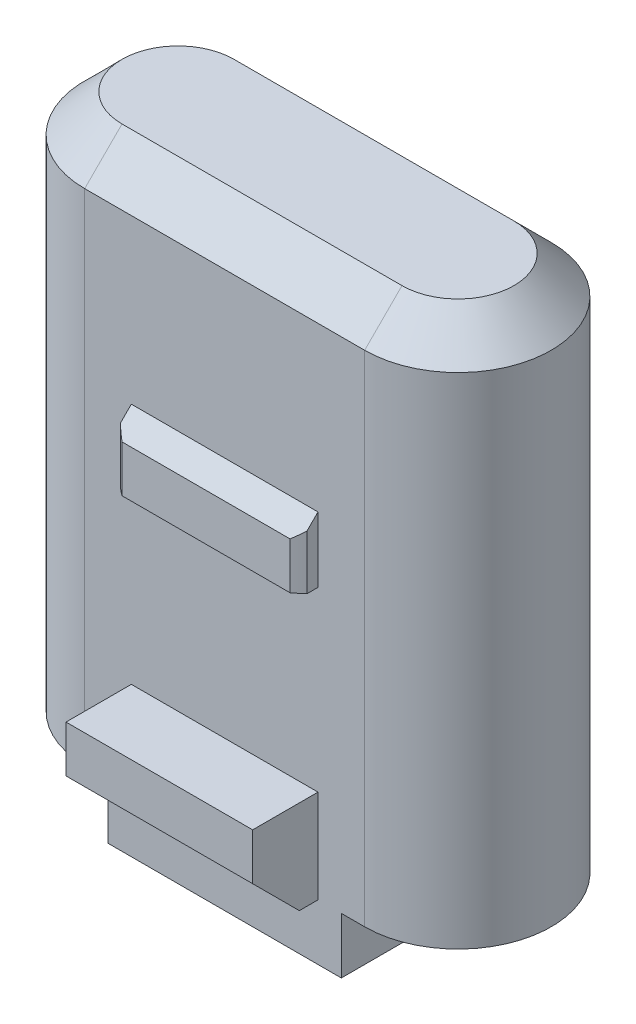
ISO-10303-21;
HEADER;
FILE_DESCRIPTION(('STEP AP214'),'2;1');
FILE_NAME('part.step','',(''),(''),'','','');
FILE_SCHEMA(('AUTOMOTIVE_DESIGN { 1 0 10303 214 1 1 1 1 }'));
ENDSEC;
DATA;
#1=APPLICATION_CONTEXT('core data for automotive mechanical design processes');
#2=APPLICATION_PROTOCOL_DEFINITION('international standard','automotive_design',2000,#1);
#3=PRODUCT_CONTEXT('',#1,'mechanical');
#4=PRODUCT('Part','Part','',(#3));
#5=PRODUCT_RELATED_PRODUCT_CATEGORY('part','',(#4));
#6=PRODUCT_DEFINITION_FORMATION('','',#4);
#7=PRODUCT_DEFINITION_CONTEXT('part definition',#1,'design');
#8=PRODUCT_DEFINITION('design','',#6,#7);
#9=PRODUCT_DEFINITION_SHAPE('','',#8);
#10=(LENGTH_UNIT() NAMED_UNIT(*) SI_UNIT(.MILLI.,.METRE.));
#11=(NAMED_UNIT(*) PLANE_ANGLE_UNIT() SI_UNIT($,.RADIAN.));
#12=(NAMED_UNIT(*) SI_UNIT($,.STERADIAN.) SOLID_ANGLE_UNIT());
#13=UNCERTAINTY_MEASURE_WITH_UNIT(LENGTH_MEASURE(1.E-05),#10,'distance_accuracy_value','');
#14=(GEOMETRIC_REPRESENTATION_CONTEXT(3) GLOBAL_UNCERTAINTY_ASSIGNED_CONTEXT((#13)) GLOBAL_UNIT_ASSIGNED_CONTEXT((#10,
#11,#12)) REPRESENTATION_CONTEXT('',''));
#15=CARTESIAN_POINT('',(0.,0.,0.));
#16=DIRECTION('',(0.,0.,1.));
#17=DIRECTION('',(1.,0.,0.));
#18=AXIS2_PLACEMENT_3D('',#15,#16,#17);
#19=CARTESIAN_POINT('',(0.,12.7,-2.));
#20=DIRECTION('',(0.,0.,1.));
#21=DIRECTION('',(1.,0.,0.));
#22=AXIS2_PLACEMENT_3D('',#19,#20,#21);
#23=PLANE('',#22);
#24=DIRECTION('',(0.,-1.,0.));
#25=VECTOR('',#24,1.);
#26=CARTESIAN_POINT('',(0.,12.7,-2.));
#27=LINE('',#26,#25);
#28=CARTESIAN_POINT('',(0.,11.9,-2.));
#29=VERTEX_POINT('',#28);
#30=CARTESIAN_POINT('',(0.,1.2,-2.));
#31=VERTEX_POINT('',#30);
#32=EDGE_CURVE('E330',#29,#31,#27,.T.);
#33=ORIENTED_EDGE('',*,*,#32,.F.);
#34=DIRECTION('',(1.,0.,0.));
#35=VECTOR('',#34,1.);
#36=CARTESIAN_POINT('',(6.,11.9,-2.));
#37=LINE('',#36,#35);
#38=CARTESIAN_POINT('',(6.,11.9,-2.));
#39=VERTEX_POINT('',#38);
#40=EDGE_CURVE('E368',#29,#39,#37,.T.);
#41=ORIENTED_EDGE('',*,*,#40,.T.);
#42=DIRECTION('',(0.,-1.,0.));
#43=VECTOR('',#42,1.);
#44=CARTESIAN_POINT('',(6.,12.7,-2.));
#45=LINE('',#44,#43);
#46=CARTESIAN_POINT('',(6.,1.2,-2.));
#47=VERTEX_POINT('',#46);
#48=EDGE_CURVE('E332',#39,#47,#45,.T.);
#49=ORIENTED_EDGE('',*,*,#48,.T.);
#50=DIRECTION('',(1.,0.,0.));
#51=VECTOR('',#50,1.);
#52=CARTESIAN_POINT('',(8.,1.2,-2.));
#53=LINE('',#52,#51);
#54=CARTESIAN_POINT('',(5.5,1.2,-2.));
#55=VERTEX_POINT('',#54);
#56=EDGE_CURVE('E285',#55,#47,#53,.T.);
#57=ORIENTED_EDGE('',*,*,#56,.F.);
#58=DIRECTION('',(0.,1.,0.));
#59=VECTOR('',#58,1.);
#60=CARTESIAN_POINT('',(5.5,0.,-2.));
#61=LINE('',#60,#59);
#62=CARTESIAN_POINT('',(5.5,0.,-2.));
#63=VERTEX_POINT('',#62);
#64=EDGE_CURVE('E321',#63,#55,#61,.T.);
#65=ORIENTED_EDGE('',*,*,#64,.F.);
#66=DIRECTION('',(-1.,0.,0.));
#67=VECTOR('',#66,1.);
#68=CARTESIAN_POINT('',(0.,0.,-2.));
#69=LINE('',#68,#67);
#70=CARTESIAN_POINT('',(0.5,0.,-2.));
#71=VERTEX_POINT('',#70);
#72=EDGE_CURVE('E327',#63,#71,#69,.T.);
#73=ORIENTED_EDGE('',*,*,#72,.T.);
#74=DIRECTION('',(0.,-1.,0.));
#75=VECTOR('',#74,1.);
#76=CARTESIAN_POINT('',(0.5,0.,-2.));
#77=LINE('',#76,#75);
#78=CARTESIAN_POINT('',(0.5,1.2,-2.));
#79=VERTEX_POINT('',#78);
#80=EDGE_CURVE('E292',#79,#71,#77,.T.);
#81=ORIENTED_EDGE('',*,*,#80,.F.);
#82=DIRECTION('',(1.,0.,0.));
#83=VECTOR('',#82,1.);
#84=CARTESIAN_POINT('',(-2.,1.2,-2.));
#85=LINE('',#84,#83);
#86=EDGE_CURVE('E295',#31,#79,#85,.T.);
#87=ORIENTED_EDGE('',*,*,#86,.F.);
#88=EDGE_LOOP('',(#33,#41,#49,#57,#65,#73,#81,#87));
#89=FACE_BOUND('',#88,.T.);
#90=DIRECTION('',(-1.,0.,0.));
#91=VECTOR('',#90,1.);
#92=CARTESIAN_POINT('',(5.,7.,-2.));
#93=LINE('',#92,#91);
#94=CARTESIAN_POINT('',(5.,7.,-2.));
#95=VERTEX_POINT('',#94);
#96=CARTESIAN_POINT('',(1.,7.,-2.));
#97=VERTEX_POINT('',#96);
#98=EDGE_CURVE('E283',#95,#97,#93,.T.);
#99=ORIENTED_EDGE('',*,*,#98,.F.);
#100=DIRECTION('',(0.,1.,0.));
#101=VECTOR('',#100,1.);
#102=CARTESIAN_POINT('',(5.,8.4,-2.));
#103=LINE('',#102,#101);
#104=CARTESIAN_POINT('',(5.,8.4,-2.));
#105=VERTEX_POINT('',#104);
#106=EDGE_CURVE('E274',#95,#105,#103,.T.);
#107=ORIENTED_EDGE('',*,*,#106,.T.);
#108=DIRECTION('',(-1.,0.,0.));
#109=VECTOR('',#108,1.);
#110=CARTESIAN_POINT('',(5.,8.4,-2.));
#111=LINE('',#110,#109);
#112=CARTESIAN_POINT('',(1.,8.4,-2.));
#113=VERTEX_POINT('',#112);
#114=EDGE_CURVE('E275',#105,#113,#111,.T.);
#115=ORIENTED_EDGE('',*,*,#114,.T.);
#116=DIRECTION('',(0.,1.,0.));
#117=VECTOR('',#116,1.);
#118=CARTESIAN_POINT('',(1.,8.4,-2.));
#119=LINE('',#118,#117);
#120=EDGE_CURVE('E492',#97,#113,#119,.T.);
#121=ORIENTED_EDGE('',*,*,#120,.F.);
#122=EDGE_LOOP('',(#99,#107,#115,#121));
#123=FACE_BOUND('',#122,.T.);
#124=DIRECTION('',(0.,1.,0.));
#125=VECTOR('',#124,1.);
#126=CARTESIAN_POINT('',(5.,1.2,-2.));
#127=LINE('',#126,#125);
#128=CARTESIAN_POINT('',(5.,1.2,-2.));
#129=VERTEX_POINT('',#128);
#130=CARTESIAN_POINT('',(5.,3.2,-2.));
#131=VERTEX_POINT('',#130);
#132=EDGE_CURVE('E453',#129,#131,#127,.T.);
#133=ORIENTED_EDGE('',*,*,#132,.T.);
#134=DIRECTION('',(-1.,0.,0.));
#135=VECTOR('',#134,1.);
#136=CARTESIAN_POINT('',(5.,3.2,-2.));
#137=LINE('',#136,#135);
#138=CARTESIAN_POINT('',(1.,3.2,-2.));
#139=VERTEX_POINT('',#138);
#140=EDGE_CURVE('E438',#131,#139,#137,.T.);
#141=ORIENTED_EDGE('',*,*,#140,.T.);
#142=DIRECTION('',(0.,1.,0.));
#143=VECTOR('',#142,1.);
#144=CARTESIAN_POINT('',(1.,1.2,-2.));
#145=LINE('',#144,#143);
#146=CARTESIAN_POINT('',(1.,1.2,-2.));
#147=VERTEX_POINT('',#146);
#148=EDGE_CURVE('E464',#147,#139,#145,.T.);
#149=ORIENTED_EDGE('',*,*,#148,.F.);
#150=DIRECTION('',(-1.,0.,0.));
#151=VECTOR('',#150,1.);
#152=CARTESIAN_POINT('',(5.,1.2,-2.));
#153=LINE('',#152,#151);
#154=EDGE_CURVE('E437',#129,#147,#153,.T.);
#155=ORIENTED_EDGE('',*,*,#154,.F.);
#156=EDGE_LOOP('',(#133,#141,#149,#155));
#157=FACE_BOUND('',#156,.T.);
#158=ADVANCED_FACE('F40',(#89,#123,#157),#23,.F.);
#159=CARTESIAN_POINT('',(0.,12.7,2.));
#160=DIRECTION('',(0.,0.,-1.));
#161=DIRECTION('',(-1.,0.,0.));
#162=AXIS2_PLACEMENT_3D('',#159,#160,#161);
#163=PLANE('',#162);
#164=DIRECTION('',(-1.,0.,0.));
#165=VECTOR('',#164,1.);
#166=CARTESIAN_POINT('',(5.,3.2,2.));
#167=LINE('',#166,#165);
#168=CARTESIAN_POINT('',(5.,3.2,2.));
#169=VERTEX_POINT('',#168);
#170=CARTESIAN_POINT('',(1.,3.2,2.));
#171=VERTEX_POINT('',#170);
#172=EDGE_CURVE('E406',#169,#171,#167,.T.);
#173=ORIENTED_EDGE('',*,*,#172,.F.);
#174=DIRECTION('',(0.,-1.,0.));
#175=VECTOR('',#174,1.);
#176=CARTESIAN_POINT('',(5.,1.2,2.));
#177=LINE('',#176,#175);
#178=CARTESIAN_POINT('',(5.,1.2,2.));
#179=VERTEX_POINT('',#178);
#180=EDGE_CURVE('E424',#169,#179,#177,.T.);
#181=ORIENTED_EDGE('',*,*,#180,.T.);
#182=DIRECTION('',(-1.,0.,0.));
#183=VECTOR('',#182,1.);
#184=CARTESIAN_POINT('',(5.,1.2,2.));
#185=LINE('',#184,#183);
#186=CARTESIAN_POINT('',(1.,1.2,2.));
#187=VERTEX_POINT('',#186);
#188=EDGE_CURVE('E409',#179,#187,#185,.T.);
#189=ORIENTED_EDGE('',*,*,#188,.T.);
#190=DIRECTION('',(0.,-1.,0.));
#191=VECTOR('',#190,1.);
#192=CARTESIAN_POINT('',(1.,1.2,2.));
#193=LINE('',#192,#191);
#194=EDGE_CURVE('E434',#171,#187,#193,.T.);
#195=ORIENTED_EDGE('',*,*,#194,.F.);
#196=EDGE_LOOP('',(#173,#181,#189,#195));
#197=FACE_BOUND('',#196,.T.);
#198=DIRECTION('',(0.,-1.,0.));
#199=VECTOR('',#198,1.);
#200=CARTESIAN_POINT('',(6.,12.7,2.));
#201=LINE('',#200,#199);
#202=CARTESIAN_POINT('',(6.,11.9,2.));
#203=VERTEX_POINT('',#202);
#204=CARTESIAN_POINT('',(6.,1.2,2.));
#205=VERTEX_POINT('',#204);
#206=EDGE_CURVE('E334',#203,#205,#201,.T.);
#207=ORIENTED_EDGE('',*,*,#206,.F.);
#208=DIRECTION('',(-1.,0.,0.));
#209=VECTOR('',#208,1.);
#210=CARTESIAN_POINT('',(0.,11.9,2.));
#211=LINE('',#210,#209);
#212=CARTESIAN_POINT('',(0.,11.9,2.));
#213=VERTEX_POINT('',#212);
#214=EDGE_CURVE('E50',#203,#213,#211,.T.);
#215=ORIENTED_EDGE('',*,*,#214,.T.);
#216=DIRECTION('',(0.,-1.,0.));
#217=VECTOR('',#216,1.);
#218=CARTESIAN_POINT('',(0.,12.7,2.));
#219=LINE('',#218,#217);
#220=CARTESIAN_POINT('',(0.,1.2,2.));
#221=VERTEX_POINT('',#220);
#222=EDGE_CURVE('E336',#213,#221,#219,.T.);
#223=ORIENTED_EDGE('',*,*,#222,.T.);
#224=DIRECTION('',(-1.,0.,0.));
#225=VECTOR('',#224,1.);
#226=CARTESIAN_POINT('',(-2.,1.2,2.));
#227=LINE('',#226,#225);
#228=CARTESIAN_POINT('',(0.5,1.2,2.));
#229=VERTEX_POINT('',#228);
#230=EDGE_CURVE('E301',#229,#221,#227,.T.);
#231=ORIENTED_EDGE('',*,*,#230,.F.);
#232=DIRECTION('',(0.,1.,0.));
#233=VECTOR('',#232,1.);
#234=CARTESIAN_POINT('',(0.5,0.,2.));
#235=LINE('',#234,#233);
#236=CARTESIAN_POINT('',(0.5,0.,2.));
#237=VERTEX_POINT('',#236);
#238=EDGE_CURVE('E298',#237,#229,#235,.T.);
#239=ORIENTED_EDGE('',*,*,#238,.F.);
#240=DIRECTION('',(1.,0.,0.));
#241=VECTOR('',#240,1.);
#242=CARTESIAN_POINT('',(0.,0.,2.));
#243=LINE('',#242,#241);
#244=CARTESIAN_POINT('',(5.5,0.,2.));
#245=VERTEX_POINT('',#244);
#246=EDGE_CURVE('E307',#237,#245,#243,.T.);
#247=ORIENTED_EDGE('',*,*,#246,.T.);
#248=DIRECTION('',(0.,-1.,0.));
#249=VECTOR('',#248,1.);
#250=CARTESIAN_POINT('',(5.5,0.,2.));
#251=LINE('',#250,#249);
#252=CARTESIAN_POINT('',(5.5,1.2,2.));
#253=VERTEX_POINT('',#252);
#254=EDGE_CURVE('E314',#253,#245,#251,.T.);
#255=ORIENTED_EDGE('',*,*,#254,.F.);
#256=DIRECTION('',(-1.,0.,0.));
#257=VECTOR('',#256,1.);
#258=CARTESIAN_POINT('',(8.,1.2,2.));
#259=LINE('',#258,#257);
#260=EDGE_CURVE('E318',#205,#253,#259,.T.);
#261=ORIENTED_EDGE('',*,*,#260,.F.);
#262=EDGE_LOOP('',(#207,#215,#223,#231,#239,#247,#255,#261));
#263=FACE_BOUND('',#262,.T.);
#264=DIRECTION('',(0.,-1.,0.));
#265=VECTOR('',#264,1.);
#266=CARTESIAN_POINT('',(5.,8.4,2.));
#267=LINE('',#266,#265);
#268=CARTESIAN_POINT('',(5.,8.4,2.));
#269=VERTEX_POINT('',#268);
#270=CARTESIAN_POINT('',(5.,7.,2.));
#271=VERTEX_POINT('',#270);
#272=EDGE_CURVE('E481',#269,#271,#267,.T.);
#273=ORIENTED_EDGE('',*,*,#272,.T.);
#274=DIRECTION('',(-1.,0.,0.));
#275=VECTOR('',#274,1.);
#276=CARTESIAN_POINT('',(5.,7.,2.));
#277=LINE('',#276,#275);
#278=CARTESIAN_POINT('',(1.,7.,2.));
#279=VERTEX_POINT('',#278);
#280=EDGE_CURVE('E472',#271,#279,#277,.T.);
#281=ORIENTED_EDGE('',*,*,#280,.T.);
#282=DIRECTION('',(0.,-1.,0.));
#283=VECTOR('',#282,1.);
#284=CARTESIAN_POINT('',(1.,8.4,2.));
#285=LINE('',#284,#283);
#286=CARTESIAN_POINT('',(1.,8.4,2.));
#287=VERTEX_POINT('',#286);
#288=EDGE_CURVE('E488',#287,#279,#285,.T.);
#289=ORIENTED_EDGE('',*,*,#288,.F.);
#290=DIRECTION('',(-1.,0.,0.));
#291=VECTOR('',#290,1.);
#292=CARTESIAN_POINT('',(5.,8.4,2.));
#293=LINE('',#292,#291);
#294=EDGE_CURVE('E468',#269,#287,#293,.T.);
#295=ORIENTED_EDGE('',*,*,#294,.F.);
#296=EDGE_LOOP('',(#273,#281,#289,#295));
#297=FACE_BOUND('',#296,.T.);
#298=ADVANCED_FACE('F542',(#197,#263,#297),#163,.F.);
#299=CARTESIAN_POINT('',(0.,12.7,0.));
#300=DIRECTION('',(0.,-1.,0.));
#301=DIRECTION('',(0.,0.,-1.));
#302=AXIS2_PLACEMENT_3D('',#299,#300,#301);
#303=CYLINDRICAL_SURFACE('',#302,2.);
#304=ORIENTED_EDGE('',*,*,#222,.F.);
#305=CARTESIAN_POINT('',(0.,11.9,0.));
#306=DIRECTION('',(0.,1.,0.));
#307=DIRECTION('',(0.,0.,1.));
#308=AXIS2_PLACEMENT_3D('',#305,#306,#307);
#309=CIRCLE('',#308,2.);
#310=EDGE_CURVE('E11',#213,#29,#309,.F.);
#311=ORIENTED_EDGE('',*,*,#310,.T.);
#312=ORIENTED_EDGE('',*,*,#32,.T.);
#313=CARTESIAN_POINT('',(0.,1.2,0.));
#314=DIRECTION('',(0.,1.,0.));
#315=DIRECTION('',(0.,0.,1.));
#316=AXIS2_PLACEMENT_3D('',#313,#314,#315);
#317=CIRCLE('',#316,2.);
#318=EDGE_CURVE('E289',#221,#31,#317,.F.);
#319=ORIENTED_EDGE('',*,*,#318,.F.);
#320=EDGE_LOOP('',(#304,#311,#312,#319));
#321=FACE_BOUND('',#320,.T.);
#322=ADVANCED_FACE('F568',(#321),#303,.T.);
#323=CARTESIAN_POINT('',(6.,12.7,0.));
#324=DIRECTION('',(0.,-1.,0.));
#325=DIRECTION('',(0.,0.,-1.));
#326=AXIS2_PLACEMENT_3D('',#323,#324,#325);
#327=CYLINDRICAL_SURFACE('',#326,2.);
#328=ORIENTED_EDGE('',*,*,#48,.F.);
#329=CARTESIAN_POINT('',(6.,11.9,0.));
#330=DIRECTION('',(0.,1.,0.));
#331=DIRECTION('',(0.,0.,1.));
#332=AXIS2_PLACEMENT_3D('',#329,#330,#331);
#333=CIRCLE('',#332,2.);
#334=EDGE_CURVE('E365',#39,#203,#333,.F.);
#335=ORIENTED_EDGE('',*,*,#334,.T.);
#336=ORIENTED_EDGE('',*,*,#206,.T.);
#337=CARTESIAN_POINT('',(6.,1.2,0.));
#338=DIRECTION('',(0.,1.,0.));
#339=DIRECTION('',(-1.,0.,0.));
#340=AXIS2_PLACEMENT_3D('',#337,#338,#339);
#341=CIRCLE('',#340,2.);
#342=EDGE_CURVE('E293',#47,#205,#341,.F.);
#343=ORIENTED_EDGE('',*,*,#342,.F.);
#344=EDGE_LOOP('',(#328,#335,#336,#343));
#345=FACE_BOUND('',#344,.T.);
#346=ADVANCED_FACE('F575',(#345),#327,.T.);
#347=CARTESIAN_POINT('',(0.,12.7,0.));
#348=DIRECTION('',(0.,1.,0.));
#349=DIRECTION('',(0.,0.,1.));
#350=AXIS2_PLACEMENT_3D('',#347,#348,#349);
#351=PLANE('',#350);
#352=DIRECTION('',(1.,0.,0.));
#353=VECTOR('',#352,1.);
#354=CARTESIAN_POINT('',(6.,12.7,1.2));
#355=LINE('',#354,#353);
#356=CARTESIAN_POINT('',(0.,12.7,1.2));
#357=VERTEX_POINT('',#356);
#358=CARTESIAN_POINT('',(6.,12.7,1.2));
#359=VERTEX_POINT('',#358);
#360=EDGE_CURVE('E358',#357,#359,#355,.T.);
#361=ORIENTED_EDGE('',*,*,#360,.T.);
#362=CARTESIAN_POINT('',(6.,12.7,0.));
#363=DIRECTION('',(0.,1.,0.));
#364=DIRECTION('',(0.,0.,1.));
#365=AXIS2_PLACEMENT_3D('',#362,#363,#364);
#366=CIRCLE('',#365,1.2);
#367=CARTESIAN_POINT('',(6.,12.7,-1.2));
#368=VERTEX_POINT('',#367);
#369=EDGE_CURVE('E362',#359,#368,#366,.T.);
#370=ORIENTED_EDGE('',*,*,#369,.T.);
#371=DIRECTION('',(-1.,0.,0.));
#372=VECTOR('',#371,1.);
#373=CARTESIAN_POINT('',(0.,12.7,-1.2));
#374=LINE('',#373,#372);
#375=CARTESIAN_POINT('',(0.,12.7,-1.2));
#376=VERTEX_POINT('',#375);
#377=EDGE_CURVE('E360',#368,#376,#374,.T.);
#378=ORIENTED_EDGE('',*,*,#377,.T.);
#379=CARTESIAN_POINT('',(0.,12.7,0.));
#380=DIRECTION('',(0.,1.,0.));
#381=DIRECTION('',(0.,0.,1.));
#382=AXIS2_PLACEMENT_3D('',#379,#380,#381);
#383=CIRCLE('',#382,1.2);
#384=EDGE_CURVE('E356',#376,#357,#383,.T.);
#385=ORIENTED_EDGE('',*,*,#384,.T.);
#386=EDGE_LOOP('',(#361,#370,#378,#385));
#387=FACE_BOUND('',#386,.T.);
#388=ADVANCED_FACE('F577',(#387),#351,.T.);
#389=CARTESIAN_POINT('',(0.,0.,0.));
#390=DIRECTION('',(0.,1.,0.));
#391=DIRECTION('',(0.,0.,1.));
#392=AXIS2_PLACEMENT_3D('',#389,#390,#391);
#393=PLANE('',#392);
#394=ORIENTED_EDGE('',*,*,#246,.F.);
#395=DIRECTION('',(0.,0.,1.));
#396=VECTOR('',#395,1.);
#397=CARTESIAN_POINT('',(0.5,0.,-2.001));
#398=LINE('',#397,#396);
#399=EDGE_CURVE('E304',#71,#237,#398,.T.);
#400=ORIENTED_EDGE('',*,*,#399,.F.);
#401=ORIENTED_EDGE('',*,*,#72,.F.);
#402=DIRECTION('',(0.,0.,1.));
#403=VECTOR('',#402,1.);
#404=CARTESIAN_POINT('',(5.5,0.,-2.001));
#405=LINE('',#404,#403);
#406=EDGE_CURVE('E311',#63,#245,#405,.T.);
#407=ORIENTED_EDGE('',*,*,#406,.T.);
#408=EDGE_LOOP('',(#394,#400,#401,#407));
#409=FACE_BOUND('',#408,.T.);
#410=ADVANCED_FACE('F573',(#409),#393,.F.);
#411=CARTESIAN_POINT('',(5.5,0.,-2.001));
#412=DIRECTION('',(-1.,0.,0.));
#413=DIRECTION('',(0.,0.,1.));
#414=AXIS2_PLACEMENT_3D('',#411,#412,#413);
#415=PLANE('',#414);
#416=ORIENTED_EDGE('',*,*,#64,.T.);
#417=DIRECTION('',(0.,0.,1.));
#418=VECTOR('',#417,1.);
#419=CARTESIAN_POINT('',(5.5,1.2,-2.001));
#420=LINE('',#419,#418);
#421=EDGE_CURVE('E312',#55,#253,#420,.T.);
#422=ORIENTED_EDGE('',*,*,#421,.T.);
#423=ORIENTED_EDGE('',*,*,#254,.T.);
#424=ORIENTED_EDGE('',*,*,#406,.F.);
#425=EDGE_LOOP('',(#416,#422,#423,#424));
#426=FACE_BOUND('',#425,.T.);
#427=ADVANCED_FACE('F633',(#426),#415,.F.);
#428=CARTESIAN_POINT('',(8.,1.2,-2.001));
#429=DIRECTION('',(0.,1.,0.));
#430=DIRECTION('',(-1.,0.,0.));
#431=AXIS2_PLACEMENT_3D('',#428,#429,#430);
#432=PLANE('',#431);
#433=ORIENTED_EDGE('',*,*,#260,.T.);
#434=ORIENTED_EDGE('',*,*,#421,.F.);
#435=ORIENTED_EDGE('',*,*,#56,.T.);
#436=ORIENTED_EDGE('',*,*,#342,.T.);
#437=EDGE_LOOP('',(#433,#434,#435,#436));
#438=FACE_BOUND('',#437,.T.);
#439=ADVANCED_FACE('F638',(#438),#432,.F.);
#440=CARTESIAN_POINT('',(-2.,1.2,-2.001));
#441=DIRECTION('',(0.,1.,0.));
#442=DIRECTION('',(0.,0.,1.));
#443=AXIS2_PLACEMENT_3D('',#440,#441,#442);
#444=PLANE('',#443);
#445=ORIENTED_EDGE('',*,*,#318,.T.);
#446=ORIENTED_EDGE('',*,*,#86,.T.);
#447=DIRECTION('',(0.,0.,1.));
#448=VECTOR('',#447,1.);
#449=CARTESIAN_POINT('',(0.5,1.2,-2.001));
#450=LINE('',#449,#448);
#451=EDGE_CURVE('E305',#79,#229,#450,.T.);
#452=ORIENTED_EDGE('',*,*,#451,.T.);
#453=ORIENTED_EDGE('',*,*,#230,.T.);
#454=EDGE_LOOP('',(#445,#446,#452,#453));
#455=FACE_BOUND('',#454,.T.);
#456=ADVANCED_FACE('F642',(#455),#444,.F.);
#457=CARTESIAN_POINT('',(0.5,0.,-2.001));
#458=DIRECTION('',(1.,0.,0.));
#459=DIRECTION('',(0.,0.,-1.));
#460=AXIS2_PLACEMENT_3D('',#457,#458,#459);
#461=PLANE('',#460);
#462=ORIENTED_EDGE('',*,*,#80,.T.);
#463=ORIENTED_EDGE('',*,*,#399,.T.);
#464=ORIENTED_EDGE('',*,*,#238,.T.);
#465=ORIENTED_EDGE('',*,*,#451,.F.);
#466=EDGE_LOOP('',(#462,#463,#464,#465));
#467=FACE_BOUND('',#466,.T.);
#468=ADVANCED_FACE('F644',(#467),#461,.F.);
#469=CARTESIAN_POINT('',(5.,7.,-2.));
#470=DIRECTION('',(0.,-1.,0.));
#471=DIRECTION('',(0.,0.,-1.));
#472=AXIS2_PLACEMENT_3D('',#469,#470,#471);
#473=PLANE('',#472);
#474=CARTESIAN_POINT('',(3.,7.,0.));
#475=DIRECTION('',(0.,-1.,0.));
#476=DIRECTION('',(0.,0.,-1.));
#477=AXIS2_PLACEMENT_3D('',#474,#475,#476);
#478=CIRCLE('',#477,3.);
#479=CARTESIAN_POINT('',(1.,7.,-2.23606797749979));
#480=VERTEX_POINT('',#479);
#481=CARTESIAN_POINT('',(1.2,7.,-2.4));
#482=VERTEX_POINT('',#481);
#483=EDGE_CURVE('E512',#480,#482,#478,.T.);
#484=ORIENTED_EDGE('',*,*,#483,.T.);
#485=DIRECTION('',(-1.,0.,0.));
#486=VECTOR('',#485,1.);
#487=CARTESIAN_POINT('',(5.,7.,-2.4));
#488=LINE('',#487,#486);
#489=CARTESIAN_POINT('',(4.8,7.,-2.4));
#490=VERTEX_POINT('',#489);
#491=EDGE_CURVE('E269',#490,#482,#488,.T.);
#492=ORIENTED_EDGE('',*,*,#491,.F.);
#493=CARTESIAN_POINT('',(3.,7.,0.));
#494=DIRECTION('',(0.,-1.,0.));
#495=DIRECTION('',(0.,0.,-1.));
#496=AXIS2_PLACEMENT_3D('',#493,#494,#495);
#497=CIRCLE('',#496,3.);
#498=CARTESIAN_POINT('',(5.,7.,-2.23606797749979));
#499=VERTEX_POINT('',#498);
#500=EDGE_CURVE('E252',#490,#499,#497,.T.);
#501=ORIENTED_EDGE('',*,*,#500,.T.);
#502=DIRECTION('',(0.,0.,1.));
#503=VECTOR('',#502,1.);
#504=CARTESIAN_POINT('',(5.,7.,-2.));
#505=LINE('',#504,#503);
#506=EDGE_CURVE('E266',#499,#95,#505,.T.);
#507=ORIENTED_EDGE('',*,*,#506,.T.);
#508=ORIENTED_EDGE('',*,*,#98,.T.);
#509=DIRECTION('',(0.,0.,1.));
#510=VECTOR('',#509,1.);
#511=CARTESIAN_POINT('',(1.,7.,-2.));
#512=LINE('',#511,#510);
#513=EDGE_CURVE('E498',#480,#97,#512,.T.);
#514=ORIENTED_EDGE('',*,*,#513,.F.);
#515=EDGE_LOOP('',(#484,#492,#501,#507,#508,#514));
#516=FACE_BOUND('',#515,.T.);
#517=ADVANCED_FACE('F264',(#516),#473,.T.);
#518=CARTESIAN_POINT('',(5.,7.,-2.4));
#519=DIRECTION('',(0.,0.,-1.));
#520=DIRECTION('',(-1.,0.,0.));
#521=AXIS2_PLACEMENT_3D('',#518,#519,#520);
#522=PLANE('',#521);
#523=DIRECTION('',(0.,1.,0.));
#524=VECTOR('',#523,1.);
#525=CARTESIAN_POINT('',(1.2,-0.000999999999999265,-2.4));
#526=LINE('',#525,#524);
#527=CARTESIAN_POINT('',(1.2,8.,-2.4));
#528=VERTEX_POINT('',#527);
#529=EDGE_CURVE('E515',#482,#528,#526,.T.);
#530=ORIENTED_EDGE('',*,*,#529,.T.);
#531=DIRECTION('',(-1.,0.,0.));
#532=VECTOR('',#531,1.);
#533=CARTESIAN_POINT('',(5.,8.,-2.4));
#534=LINE('',#533,#532);
#535=CARTESIAN_POINT('',(4.8,8.,-2.4));
#536=VERTEX_POINT('',#535);
#537=EDGE_CURVE('E278',#536,#528,#534,.T.);
#538=ORIENTED_EDGE('',*,*,#537,.F.);
#539=DIRECTION('',(0.,1.,0.));
#540=VECTOR('',#539,1.);
#541=CARTESIAN_POINT('',(4.8,-0.000999999999999265,-2.4));
#542=LINE('',#541,#540);
#543=EDGE_CURVE('E521',#490,#536,#542,.T.);
#544=ORIENTED_EDGE('',*,*,#543,.F.);
#545=ORIENTED_EDGE('',*,*,#491,.T.);
#546=EDGE_LOOP('',(#530,#538,#544,#545));
#547=FACE_BOUND('',#546,.T.);
#548=ADVANCED_FACE('F519',(#547),#522,.T.);
#549=CARTESIAN_POINT('',(5.,8.,-2.4));
#550=DIRECTION('',(0.,0.707106781186544,-0.707106781186551));
#551=DIRECTION('',(0.,0.707106781186551,0.707106781186544));
#552=AXIS2_PLACEMENT_3D('',#549,#550,#551);
#553=PLANE('',#552);
#554=CARTESIAN_POINT('',(3.,10.4,0.));
#555=DIRECTION('',(0.,0.707106781186544,-0.707106781186551));
#556=DIRECTION('',(0.,0.707106781186551,0.707106781186544));
#557=AXIS2_PLACEMENT_3D('',#554,#555,#556);
#558=ELLIPSE('',#557,4.24264068711931,3.);
#559=CARTESIAN_POINT('',(1.,8.16393202250021,-2.23606797749979));
#560=VERTEX_POINT('',#559);
#561=EDGE_CURVE('E507',#528,#560,#558,.T.);
#562=ORIENTED_EDGE('',*,*,#561,.T.);
#563=DIRECTION('',(0.,-0.707106781186551,-0.707106781186544));
#564=VECTOR('',#563,1.);
#565=CARTESIAN_POINT('',(1.,8.,-2.4));
#566=LINE('',#565,#564);
#567=EDGE_CURVE('E495',#113,#560,#566,.T.);
#568=ORIENTED_EDGE('',*,*,#567,.F.);
#569=ORIENTED_EDGE('',*,*,#114,.F.);
#570=DIRECTION('',(0.,-0.707106781186551,-0.707106781186544));
#571=VECTOR('',#570,1.);
#572=CARTESIAN_POINT('',(5.,8.,-2.4));
#573=LINE('',#572,#571);
#574=CARTESIAN_POINT('',(5.,8.16393202250021,-2.23606797749979));
#575=VERTEX_POINT('',#574);
#576=EDGE_CURVE('E276',#105,#575,#573,.T.);
#577=ORIENTED_EDGE('',*,*,#576,.T.);
#578=CARTESIAN_POINT('',(3.,10.4,0.));
#579=DIRECTION('',(0.,0.707106781186544,-0.707106781186551));
#580=DIRECTION('',(0.,0.707106781186551,0.707106781186544));
#581=AXIS2_PLACEMENT_3D('',#578,#579,#580);
#582=ELLIPSE('',#581,4.24264068711931,3.);
#583=EDGE_CURVE('E255',#575,#536,#582,.T.);
#584=ORIENTED_EDGE('',*,*,#583,.T.);
#585=ORIENTED_EDGE('',*,*,#537,.T.);
#586=EDGE_LOOP('',(#562,#568,#569,#577,#584,#585));
#587=FACE_BOUND('',#586,.T.);
#588=ADVANCED_FACE('F506',(#587),#553,.T.);
#589=CARTESIAN_POINT('',(5.,0.,0.));
#590=DIRECTION('',(1.,0.,0.));
#591=DIRECTION('',(0.,0.,-1.));
#592=AXIS2_PLACEMENT_3D('',#589,#590,#591);
#593=PLANE('',#592);
#594=DIRECTION('',(0.,1.,0.));
#595=VECTOR('',#594,1.);
#596=CARTESIAN_POINT('',(5.,-0.000999999999999265,-2.23606797749979));
#597=LINE('',#596,#595);
#598=EDGE_CURVE('E249',#499,#575,#597,.T.);
#599=ORIENTED_EDGE('',*,*,#598,.T.);
#600=ORIENTED_EDGE('',*,*,#576,.F.);
#601=ORIENTED_EDGE('',*,*,#106,.F.);
#602=ORIENTED_EDGE('',*,*,#506,.F.);
#603=EDGE_LOOP('',(#599,#600,#601,#602));
#604=FACE_BOUND('',#603,.T.);
#605=ADVANCED_FACE('F273',(#604),#593,.T.);
#606=CARTESIAN_POINT('',(1.,0.,0.));
#607=DIRECTION('',(1.,0.,0.));
#608=DIRECTION('',(0.,0.,-1.));
#609=AXIS2_PLACEMENT_3D('',#606,#607,#608);
#610=PLANE('',#609);
#611=ORIENTED_EDGE('',*,*,#567,.T.);
#612=DIRECTION('',(0.,1.,0.));
#613=VECTOR('',#612,1.);
#614=CARTESIAN_POINT('',(1.,-0.000999999999999265,-2.23606797749979));
#615=LINE('',#614,#613);
#616=EDGE_CURVE('E514',#480,#560,#615,.T.);
#617=ORIENTED_EDGE('',*,*,#616,.F.);
#618=ORIENTED_EDGE('',*,*,#513,.T.);
#619=ORIENTED_EDGE('',*,*,#120,.T.);
#620=EDGE_LOOP('',(#611,#617,#618,#619));
#621=FACE_BOUND('',#620,.T.);
#622=ADVANCED_FACE('F510',(#621),#610,.F.);
#623=CARTESIAN_POINT('',(5.,8.,2.4));
#624=DIRECTION('',(0.,0.707106781186544,0.707106781186551));
#625=DIRECTION('',(0.,-0.707106781186551,0.707106781186544));
#626=AXIS2_PLACEMENT_3D('',#623,#624,#625);
#627=PLANE('',#626);
#628=CARTESIAN_POINT('',(3.,10.4,0.));
#629=DIRECTION('',(0.,0.707106781186544,0.707106781186551));
#630=DIRECTION('',(0.,0.707106781186551,-0.707106781186544));
#631=AXIS2_PLACEMENT_3D('',#628,#629,#630);
#632=ELLIPSE('',#631,4.24264068711931,3.);
#633=CARTESIAN_POINT('',(1.,8.16393202250021,2.23606797749979));
#634=VERTEX_POINT('',#633);
#635=CARTESIAN_POINT('',(1.2,8.,2.4));
#636=VERTEX_POINT('',#635);
#637=EDGE_CURVE('E386',#634,#636,#632,.T.);
#638=ORIENTED_EDGE('',*,*,#637,.T.);
#639=DIRECTION('',(-1.,0.,0.));
#640=VECTOR('',#639,1.);
#641=CARTESIAN_POINT('',(5.,8.,2.4));
#642=LINE('',#641,#640);
#643=CARTESIAN_POINT('',(4.8,8.,2.4));
#644=VERTEX_POINT('',#643);
#645=EDGE_CURVE('E467',#644,#636,#642,.T.);
#646=ORIENTED_EDGE('',*,*,#645,.F.);
#647=CARTESIAN_POINT('',(3.,10.4,0.));
#648=DIRECTION('',(0.,0.707106781186544,0.707106781186551));
#649=DIRECTION('',(0.,0.707106781186551,-0.707106781186544));
#650=AXIS2_PLACEMENT_3D('',#647,#648,#649);
#651=ELLIPSE('',#650,4.24264068711931,3.);
#652=CARTESIAN_POINT('',(5.,8.16393202250021,2.23606797749979));
#653=VERTEX_POINT('',#652);
#654=EDGE_CURVE('E398',#644,#653,#651,.T.);
#655=ORIENTED_EDGE('',*,*,#654,.T.);
#656=DIRECTION('',(0.,0.707106781186551,-0.707106781186544));
#657=VECTOR('',#656,1.);
#658=CARTESIAN_POINT('',(5.,8.,2.4));
#659=LINE('',#658,#657);
#660=EDGE_CURVE('E484',#653,#269,#659,.T.);
#661=ORIENTED_EDGE('',*,*,#660,.T.);
#662=ORIENTED_EDGE('',*,*,#294,.T.);
#663=DIRECTION('',(0.,0.707106781186551,-0.707106781186544));
#664=VECTOR('',#663,1.);
#665=CARTESIAN_POINT('',(1.,8.,2.4));
#666=LINE('',#665,#664);
#667=EDGE_CURVE('E490',#634,#287,#666,.T.);
#668=ORIENTED_EDGE('',*,*,#667,.F.);
#669=EDGE_LOOP('',(#638,#646,#655,#661,#662,#668));
#670=FACE_BOUND('',#669,.T.);
#671=ADVANCED_FACE('F535',(#670),#627,.T.);
#672=CARTESIAN_POINT('',(5.,7.,2.4));
#673=DIRECTION('',(0.,0.,1.));
#674=DIRECTION('',(1.,0.,0.));
#675=AXIS2_PLACEMENT_3D('',#672,#673,#674);
#676=PLANE('',#675);
#677=DIRECTION('',(0.,1.,0.));
#678=VECTOR('',#677,1.);
#679=CARTESIAN_POINT('',(1.2,-0.000999999999999265,2.4));
#680=LINE('',#679,#678);
#681=CARTESIAN_POINT('',(1.2,7.,2.4));
#682=VERTEX_POINT('',#681);
#683=EDGE_CURVE('E527',#682,#636,#680,.T.);
#684=ORIENTED_EDGE('',*,*,#683,.F.);
#685=DIRECTION('',(-1.,0.,0.));
#686=VECTOR('',#685,1.);
#687=CARTESIAN_POINT('',(5.,7.,2.4));
#688=LINE('',#687,#686);
#689=CARTESIAN_POINT('',(4.8,7.,2.4));
#690=VERTEX_POINT('',#689);
#691=EDGE_CURVE('E475',#690,#682,#688,.T.);
#692=ORIENTED_EDGE('',*,*,#691,.F.);
#693=DIRECTION('',(0.,1.,0.));
#694=VECTOR('',#693,1.);
#695=CARTESIAN_POINT('',(4.8,-0.000999999999999265,2.4));
#696=LINE('',#695,#694);
#697=EDGE_CURVE('E270',#690,#644,#696,.T.);
#698=ORIENTED_EDGE('',*,*,#697,.T.);
#699=ORIENTED_EDGE('',*,*,#645,.T.);
#700=EDGE_LOOP('',(#684,#692,#698,#699));
#701=FACE_BOUND('',#700,.T.);
#702=ADVANCED_FACE('F551',(#701),#676,.T.);
#703=CARTESIAN_POINT('',(5.,7.,2.));
#704=DIRECTION('',(0.,-1.,0.));
#705=DIRECTION('',(0.,0.,-1.));
#706=AXIS2_PLACEMENT_3D('',#703,#704,#705);
#707=PLANE('',#706);
#708=CARTESIAN_POINT('',(3.,7.,0.));
#709=DIRECTION('',(0.,-1.,0.));
#710=DIRECTION('',(0.,0.,-1.));
#711=AXIS2_PLACEMENT_3D('',#708,#709,#710);
#712=CIRCLE('',#711,3.);
#713=CARTESIAN_POINT('',(1.,7.,2.23606797749979));
#714=VERTEX_POINT('',#713);
#715=EDGE_CURVE('E381',#682,#714,#712,.T.);
#716=ORIENTED_EDGE('',*,*,#715,.T.);
#717=DIRECTION('',(0.,0.,1.));
#718=VECTOR('',#717,1.);
#719=CARTESIAN_POINT('',(1.,7.,2.));
#720=LINE('',#719,#718);
#721=EDGE_CURVE('E486',#279,#714,#720,.T.);
#722=ORIENTED_EDGE('',*,*,#721,.F.);
#723=ORIENTED_EDGE('',*,*,#280,.F.);
#724=DIRECTION('',(0.,0.,1.));
#725=VECTOR('',#724,1.);
#726=CARTESIAN_POINT('',(5.,7.,2.));
#727=LINE('',#726,#725);
#728=CARTESIAN_POINT('',(5.,7.,2.23606797749979));
#729=VERTEX_POINT('',#728);
#730=EDGE_CURVE('E471',#271,#729,#727,.T.);
#731=ORIENTED_EDGE('',*,*,#730,.T.);
#732=CARTESIAN_POINT('',(3.,7.,0.));
#733=DIRECTION('',(0.,-1.,0.));
#734=DIRECTION('',(0.,0.,-1.));
#735=AXIS2_PLACEMENT_3D('',#732,#733,#734);
#736=CIRCLE('',#735,3.);
#737=EDGE_CURVE('E401',#729,#690,#736,.T.);
#738=ORIENTED_EDGE('',*,*,#737,.T.);
#739=ORIENTED_EDGE('',*,*,#691,.T.);
#740=EDGE_LOOP('',(#716,#722,#723,#731,#738,#739));
#741=FACE_BOUND('',#740,.T.);
#742=ADVANCED_FACE('F543',(#741),#707,.T.);
#743=CARTESIAN_POINT('',(5.,0.,0.));
#744=DIRECTION('',(-1.,0.,0.));
#745=DIRECTION('',(0.,0.,1.));
#746=AXIS2_PLACEMENT_3D('',#743,#744,#745);
#747=PLANE('',#746);
#748=ORIENTED_EDGE('',*,*,#660,.F.);
#749=DIRECTION('',(0.,1.,0.));
#750=VECTOR('',#749,1.);
#751=CARTESIAN_POINT('',(5.,-0.000999999999999265,2.23606797749979));
#752=LINE('',#751,#750);
#753=EDGE_CURVE('E404',#729,#653,#752,.T.);
#754=ORIENTED_EDGE('',*,*,#753,.F.);
#755=ORIENTED_EDGE('',*,*,#730,.F.);
#756=ORIENTED_EDGE('',*,*,#272,.F.);
#757=EDGE_LOOP('',(#748,#754,#755,#756));
#758=FACE_BOUND('',#757,.T.);
#759=ADVANCED_FACE('F547',(#758),#747,.F.);
#760=CARTESIAN_POINT('',(1.,0.,0.));
#761=DIRECTION('',(-1.,0.,0.));
#762=DIRECTION('',(0.,0.,1.));
#763=AXIS2_PLACEMENT_3D('',#760,#761,#762);
#764=PLANE('',#763);
#765=DIRECTION('',(0.,1.,0.));
#766=VECTOR('',#765,1.);
#767=CARTESIAN_POINT('',(1.,-0.000999999999999265,2.23606797749979));
#768=LINE('',#767,#766);
#769=EDGE_CURVE('E393',#714,#634,#768,.T.);
#770=ORIENTED_EDGE('',*,*,#769,.T.);
#771=ORIENTED_EDGE('',*,*,#667,.T.);
#772=ORIENTED_EDGE('',*,*,#288,.T.);
#773=ORIENTED_EDGE('',*,*,#721,.T.);
#774=EDGE_LOOP('',(#770,#771,#772,#773));
#775=FACE_BOUND('',#774,.T.);
#776=ADVANCED_FACE('F533',(#775),#764,.T.);
#777=CARTESIAN_POINT('',(5.,1.2,-2.));
#778=DIRECTION('',(0.,-1.,0.));
#779=DIRECTION('',(0.,0.,-1.));
#780=AXIS2_PLACEMENT_3D('',#777,#778,#779);
#781=PLANE('',#780);
#782=DIRECTION('',(0.,0.,1.));
#783=VECTOR('',#782,1.);
#784=CARTESIAN_POINT('',(1.,1.2,-2.));
#785=LINE('',#784,#783);
#786=CARTESIAN_POINT('',(1.,1.2,-2.39999999999999));
#787=VERTEX_POINT('',#786);
#788=EDGE_CURVE('E456',#787,#147,#785,.T.);
#789=ORIENTED_EDGE('',*,*,#788,.F.);
#790=DIRECTION('',(1.,0.,0.));
#791=VECTOR('',#790,1.);
#792=CARTESIAN_POINT('',(5.,1.2,-2.39999999999999));
#793=LINE('',#792,#791);
#794=CARTESIAN_POINT('',(5.,1.2,-2.39999999999999));
#795=VERTEX_POINT('',#794);
#796=EDGE_CURVE('E352',#787,#795,#793,.T.);
#797=ORIENTED_EDGE('',*,*,#796,.T.);
#798=DIRECTION('',(0.,0.,1.));
#799=VECTOR('',#798,1.);
#800=CARTESIAN_POINT('',(5.,1.2,-2.));
#801=LINE('',#800,#799);
#802=EDGE_CURVE('E441',#795,#129,#801,.T.);
#803=ORIENTED_EDGE('',*,*,#802,.T.);
#804=ORIENTED_EDGE('',*,*,#154,.T.);
#805=EDGE_LOOP('',(#789,#797,#803,#804));
#806=FACE_BOUND('',#805,.T.);
#807=ADVANCED_FACE('F662',(#806),#781,.T.);
#808=CARTESIAN_POINT('',(5.,1.2,-3.4));
#809=DIRECTION('',(0.,0.,-1.));
#810=DIRECTION('',(-1.,0.,0.));
#811=AXIS2_PLACEMENT_3D('',#808,#809,#810);
#812=PLANE('',#811);
#813=DIRECTION('',(0.,-1.,0.));
#814=VECTOR('',#813,1.);
#815=CARTESIAN_POINT('',(5.,1.2,-3.4));
#816=LINE('',#815,#814);
#817=CARTESIAN_POINT('',(5.,3.2,-3.4));
#818=VERTEX_POINT('',#817);
#819=CARTESIAN_POINT('',(5.,2.2,-3.4));
#820=VERTEX_POINT('',#819);
#821=EDGE_CURVE('E447',#818,#820,#816,.T.);
#822=ORIENTED_EDGE('',*,*,#821,.T.);
#823=DIRECTION('',(-1.,0.,0.));
#824=VECTOR('',#823,1.);
#825=CARTESIAN_POINT('',(5.,2.2,-3.4));
#826=LINE('',#825,#824);
#827=CARTESIAN_POINT('',(1.,2.2,-3.4));
#828=VERTEX_POINT('',#827);
#829=EDGE_CURVE('E347',#820,#828,#826,.T.);
#830=ORIENTED_EDGE('',*,*,#829,.T.);
#831=DIRECTION('',(0.,-1.,0.));
#832=VECTOR('',#831,1.);
#833=CARTESIAN_POINT('',(1.,1.2,-3.4));
#834=LINE('',#833,#832);
#835=CARTESIAN_POINT('',(1.,3.2,-3.4));
#836=VERTEX_POINT('',#835);
#837=EDGE_CURVE('E458',#836,#828,#834,.T.);
#838=ORIENTED_EDGE('',*,*,#837,.F.);
#839=DIRECTION('',(-1.,0.,0.));
#840=VECTOR('',#839,1.);
#841=CARTESIAN_POINT('',(5.,3.2,-3.4));
#842=LINE('',#841,#840);
#843=EDGE_CURVE('E442',#818,#836,#842,.T.);
#844=ORIENTED_EDGE('',*,*,#843,.F.);
#845=EDGE_LOOP('',(#822,#830,#838,#844));
#846=FACE_BOUND('',#845,.T.);
#847=ADVANCED_FACE('F679',(#846),#812,.T.);
#848=CARTESIAN_POINT('',(5.,3.2,-2.));
#849=DIRECTION('',(0.,1.,0.));
#850=DIRECTION('',(0.,0.,1.));
#851=AXIS2_PLACEMENT_3D('',#848,#849,#850);
#852=PLANE('',#851);
#853=ORIENTED_EDGE('',*,*,#843,.T.);
#854=DIRECTION('',(0.,0.,-1.));
#855=VECTOR('',#854,1.);
#856=CARTESIAN_POINT('',(1.,3.2,-2.));
#857=LINE('',#856,#855);
#858=EDGE_CURVE('E461',#139,#836,#857,.T.);
#859=ORIENTED_EDGE('',*,*,#858,.F.);
#860=ORIENTED_EDGE('',*,*,#140,.F.);
#861=DIRECTION('',(0.,0.,-1.));
#862=VECTOR('',#861,1.);
#863=CARTESIAN_POINT('',(5.,3.2,-2.));
#864=LINE('',#863,#862);
#865=EDGE_CURVE('E450',#131,#818,#864,.T.);
#866=ORIENTED_EDGE('',*,*,#865,.T.);
#867=EDGE_LOOP('',(#853,#859,#860,#866));
#868=FACE_BOUND('',#867,.T.);
#869=ADVANCED_FACE('F688',(#868),#852,.T.);
#870=CARTESIAN_POINT('',(5.,0.,0.));
#871=DIRECTION('',(-1.,0.,0.));
#872=DIRECTION('',(0.,0.,1.));
#873=AXIS2_PLACEMENT_3D('',#870,#871,#872);
#874=PLANE('',#873);
#875=ORIENTED_EDGE('',*,*,#802,.F.);
#876=DIRECTION('',(0.,-0.707106781186546,0.707106781186549));
#877=VECTOR('',#876,1.);
#878=CARTESIAN_POINT('',(5.,2.2,-3.4));
#879=LINE('',#878,#877);
#880=EDGE_CURVE('E354',#795,#820,#879,.F.);
#881=ORIENTED_EDGE('',*,*,#880,.T.);
#882=ORIENTED_EDGE('',*,*,#821,.F.);
#883=ORIENTED_EDGE('',*,*,#865,.F.);
#884=ORIENTED_EDGE('',*,*,#132,.F.);
#885=EDGE_LOOP('',(#875,#881,#882,#883,#884));
#886=FACE_BOUND('',#885,.T.);
#887=ADVANCED_FACE('F697',(#886),#874,.F.);
#888=CARTESIAN_POINT('',(1.,0.,0.));
#889=DIRECTION('',(-1.,0.,0.));
#890=DIRECTION('',(0.,0.,1.));
#891=AXIS2_PLACEMENT_3D('',#888,#889,#890);
#892=PLANE('',#891);
#893=ORIENTED_EDGE('',*,*,#837,.T.);
#894=DIRECTION('',(0.,0.707106781186546,-0.707106781186549));
#895=VECTOR('',#894,1.);
#896=CARTESIAN_POINT('',(1.,-0.599999999999994,-0.599999999999991));
#897=LINE('',#896,#895);
#898=EDGE_CURVE('E350',#828,#787,#897,.F.);
#899=ORIENTED_EDGE('',*,*,#898,.T.);
#900=ORIENTED_EDGE('',*,*,#788,.T.);
#901=ORIENTED_EDGE('',*,*,#148,.T.);
#902=ORIENTED_EDGE('',*,*,#858,.T.);
#903=EDGE_LOOP('',(#893,#899,#900,#901,#902));
#904=FACE_BOUND('',#903,.T.);
#905=ADVANCED_FACE('F706',(#904),#892,.T.);
#906=CARTESIAN_POINT('',(5.,3.2,2.));
#907=DIRECTION('',(0.,1.,0.));
#908=DIRECTION('',(0.,0.,1.));
#909=AXIS2_PLACEMENT_3D('',#906,#907,#908);
#910=PLANE('',#909);
#911=ORIENTED_EDGE('',*,*,#172,.T.);
#912=DIRECTION('',(0.,0.,-1.));
#913=VECTOR('',#912,1.);
#914=CARTESIAN_POINT('',(1.,3.2,2.));
#915=LINE('',#914,#913);
#916=CARTESIAN_POINT('',(1.,3.2,3.4));
#917=VERTEX_POINT('',#916);
#918=EDGE_CURVE('E426',#917,#171,#915,.T.);
#919=ORIENTED_EDGE('',*,*,#918,.F.);
#920=DIRECTION('',(-1.,0.,0.));
#921=VECTOR('',#920,1.);
#922=CARTESIAN_POINT('',(5.,3.2,3.4));
#923=LINE('',#922,#921);
#924=CARTESIAN_POINT('',(5.,3.2,3.4));
#925=VERTEX_POINT('',#924);
#926=EDGE_CURVE('E412',#925,#917,#923,.T.);
#927=ORIENTED_EDGE('',*,*,#926,.F.);
#928=DIRECTION('',(0.,0.,-1.));
#929=VECTOR('',#928,1.);
#930=CARTESIAN_POINT('',(5.,3.2,2.));
#931=LINE('',#930,#929);
#932=EDGE_CURVE('E411',#925,#169,#931,.T.);
#933=ORIENTED_EDGE('',*,*,#932,.T.);
#934=EDGE_LOOP('',(#911,#919,#927,#933));
#935=FACE_BOUND('',#934,.T.);
#936=ADVANCED_FACE('F714',(#935),#910,.T.);
#937=CARTESIAN_POINT('',(5.,1.2,3.4));
#938=DIRECTION('',(0.,0.,1.));
#939=DIRECTION('',(1.,0.,0.));
#940=AXIS2_PLACEMENT_3D('',#937,#938,#939);
#941=PLANE('',#940);
#942=DIRECTION('',(0.,1.,0.));
#943=VECTOR('',#942,1.);
#944=CARTESIAN_POINT('',(1.,1.2,3.4));
#945=LINE('',#944,#943);
#946=CARTESIAN_POINT('',(1.,2.2,3.4));
#947=VERTEX_POINT('',#946);
#948=EDGE_CURVE('E429',#947,#917,#945,.T.);
#949=ORIENTED_EDGE('',*,*,#948,.F.);
#950=DIRECTION('',(1.,0.,0.));
#951=VECTOR('',#950,1.);
#952=CARTESIAN_POINT('',(5.,2.2,3.4));
#953=LINE('',#952,#951);
#954=CARTESIAN_POINT('',(5.,2.2,3.4));
#955=VERTEX_POINT('',#954);
#956=EDGE_CURVE('E343',#947,#955,#953,.T.);
#957=ORIENTED_EDGE('',*,*,#956,.T.);
#958=DIRECTION('',(0.,1.,0.));
#959=VECTOR('',#958,1.);
#960=CARTESIAN_POINT('',(5.,1.2,3.4));
#961=LINE('',#960,#959);
#962=EDGE_CURVE('E419',#955,#925,#961,.T.);
#963=ORIENTED_EDGE('',*,*,#962,.T.);
#964=ORIENTED_EDGE('',*,*,#926,.T.);
#965=EDGE_LOOP('',(#949,#957,#963,#964));
#966=FACE_BOUND('',#965,.T.);
#967=ADVANCED_FACE('F722',(#966),#941,.T.);
#968=CARTESIAN_POINT('',(5.,1.2,2.));
#969=DIRECTION('',(0.,-1.,0.));
#970=DIRECTION('',(0.,0.,-1.));
#971=AXIS2_PLACEMENT_3D('',#968,#969,#970);
#972=PLANE('',#971);
#973=DIRECTION('',(0.,0.,1.));
#974=VECTOR('',#973,1.);
#975=CARTESIAN_POINT('',(5.,1.2,2.));
#976=LINE('',#975,#974);
#977=CARTESIAN_POINT('',(5.,1.2,2.4));
#978=VERTEX_POINT('',#977);
#979=EDGE_CURVE('E421',#179,#978,#976,.T.);
#980=ORIENTED_EDGE('',*,*,#979,.T.);
#981=DIRECTION('',(-1.,0.,0.));
#982=VECTOR('',#981,1.);
#983=CARTESIAN_POINT('',(5.,1.2,2.4));
#984=LINE('',#983,#982);
#985=CARTESIAN_POINT('',(1.,1.2,2.4));
#986=VERTEX_POINT('',#985);
#987=EDGE_CURVE('E338',#978,#986,#984,.T.);
#988=ORIENTED_EDGE('',*,*,#987,.T.);
#989=DIRECTION('',(0.,0.,1.));
#990=VECTOR('',#989,1.);
#991=CARTESIAN_POINT('',(1.,1.2,2.));
#992=LINE('',#991,#990);
#993=EDGE_CURVE('E431',#187,#986,#992,.T.);
#994=ORIENTED_EDGE('',*,*,#993,.F.);
#995=ORIENTED_EDGE('',*,*,#188,.F.);
#996=EDGE_LOOP('',(#980,#988,#994,#995));
#997=FACE_BOUND('',#996,.T.);
#998=ADVANCED_FACE('F730',(#997),#972,.T.);
#999=CARTESIAN_POINT('',(5.,0.,0.));
#1000=DIRECTION('',(1.,0.,0.));
#1001=DIRECTION('',(0.,0.,-1.));
#1002=AXIS2_PLACEMENT_3D('',#999,#1000,#1001);
#1003=PLANE('',#1002);
#1004=ORIENTED_EDGE('',*,*,#962,.F.);
#1005=DIRECTION('',(0.,0.707106781186548,0.707106781186547));
#1006=VECTOR('',#1005,1.);
#1007=CARTESIAN_POINT('',(5.,-0.600000000000001,0.600000000000002));
#1008=LINE('',#1007,#1006);
#1009=EDGE_CURVE('E345',#955,#978,#1008,.F.);
#1010=ORIENTED_EDGE('',*,*,#1009,.T.);
#1011=ORIENTED_EDGE('',*,*,#979,.F.);
#1012=ORIENTED_EDGE('',*,*,#180,.F.);
#1013=ORIENTED_EDGE('',*,*,#932,.F.);
#1014=EDGE_LOOP('',(#1004,#1010,#1011,#1012,#1013));
#1015=FACE_BOUND('',#1014,.T.);
#1016=ADVANCED_FACE('F738',(#1015),#1003,.T.);
#1017=CARTESIAN_POINT('',(1.,0.,0.));
#1018=DIRECTION('',(1.,0.,0.));
#1019=DIRECTION('',(0.,0.,-1.));
#1020=AXIS2_PLACEMENT_3D('',#1017,#1018,#1019);
#1021=PLANE('',#1020);
#1022=ORIENTED_EDGE('',*,*,#993,.T.);
#1023=DIRECTION('',(0.,-0.707106781186548,-0.707106781186547));
#1024=VECTOR('',#1023,1.);
#1025=CARTESIAN_POINT('',(1.,1.2,2.4));
#1026=LINE('',#1025,#1024);
#1027=EDGE_CURVE('E341',#986,#947,#1026,.F.);
#1028=ORIENTED_EDGE('',*,*,#1027,.T.);
#1029=ORIENTED_EDGE('',*,*,#948,.T.);
#1030=ORIENTED_EDGE('',*,*,#918,.T.);
#1031=ORIENTED_EDGE('',*,*,#194,.T.);
#1032=EDGE_LOOP('',(#1022,#1028,#1029,#1030,#1031));
#1033=FACE_BOUND('',#1032,.T.);
#1034=ADVANCED_FACE('F746',(#1033),#1021,.F.);
#1035=CARTESIAN_POINT('',(3.,-0.000999999999999265,0.));
#1036=DIRECTION('',(0.,1.,0.));
#1037=DIRECTION('',(0.,0.,1.));
#1038=AXIS2_PLACEMENT_3D('',#1035,#1036,#1037);
#1039=CYLINDRICAL_SURFACE('',#1038,3.);
#1040=ORIENTED_EDGE('',*,*,#769,.F.);
#1041=ORIENTED_EDGE('',*,*,#715,.F.);
#1042=ORIENTED_EDGE('',*,*,#683,.T.);
#1043=ORIENTED_EDGE('',*,*,#637,.F.);
#1044=EDGE_LOOP('',(#1040,#1041,#1042,#1043));
#1045=FACE_BOUND('',#1044,.T.);
#1046=ADVANCED_FACE('F754',(#1045),#1039,.T.);
#1047=CARTESIAN_POINT('',(3.,-0.000999999999999265,0.));
#1048=DIRECTION('',(0.,1.,0.));
#1049=DIRECTION('',(0.,0.,1.));
#1050=AXIS2_PLACEMENT_3D('',#1047,#1048,#1049);
#1051=CYLINDRICAL_SURFACE('',#1050,3.);
#1052=ORIENTED_EDGE('',*,*,#697,.F.);
#1053=ORIENTED_EDGE('',*,*,#737,.F.);
#1054=ORIENTED_EDGE('',*,*,#753,.T.);
#1055=ORIENTED_EDGE('',*,*,#654,.F.);
#1056=EDGE_LOOP('',(#1052,#1053,#1054,#1055));
#1057=FACE_BOUND('',#1056,.T.);
#1058=ADVANCED_FACE('F549',(#1057),#1051,.T.);
#1059=CARTESIAN_POINT('',(3.,-0.000999999999999265,0.));
#1060=DIRECTION('',(0.,1.,0.));
#1061=DIRECTION('',(0.,0.,1.));
#1062=AXIS2_PLACEMENT_3D('',#1059,#1060,#1061);
#1063=CYLINDRICAL_SURFACE('',#1062,3.);
#1064=ORIENTED_EDGE('',*,*,#616,.T.);
#1065=ORIENTED_EDGE('',*,*,#561,.F.);
#1066=ORIENTED_EDGE('',*,*,#529,.F.);
#1067=ORIENTED_EDGE('',*,*,#483,.F.);
#1068=EDGE_LOOP('',(#1064,#1065,#1066,#1067));
#1069=FACE_BOUND('',#1068,.T.);
#1070=ADVANCED_FACE('F768',(#1069),#1063,.T.);
#1071=CARTESIAN_POINT('',(3.,-0.000999999999999265,0.));
#1072=DIRECTION('',(0.,1.,0.));
#1073=DIRECTION('',(0.,0.,1.));
#1074=AXIS2_PLACEMENT_3D('',#1071,#1072,#1073);
#1075=CYLINDRICAL_SURFACE('',#1074,3.);
#1076=ORIENTED_EDGE('',*,*,#543,.T.);
#1077=ORIENTED_EDGE('',*,*,#583,.F.);
#1078=ORIENTED_EDGE('',*,*,#598,.F.);
#1079=ORIENTED_EDGE('',*,*,#500,.F.);
#1080=EDGE_LOOP('',(#1076,#1077,#1078,#1079));
#1081=FACE_BOUND('',#1080,.T.);
#1082=ADVANCED_FACE('F251',(#1081),#1075,.T.);
#1083=CARTESIAN_POINT('',(5.,1.2,2.4));
#1084=DIRECTION('',(0.,0.707106781186547,-0.707106781186548));
#1085=DIRECTION('',(-1.,0.,0.));
#1086=AXIS2_PLACEMENT_3D('',#1083,#1084,#1085);
#1087=PLANE('',#1086);
#1088=ORIENTED_EDGE('',*,*,#1009,.F.);
#1089=ORIENTED_EDGE('',*,*,#956,.F.);
#1090=ORIENTED_EDGE('',*,*,#1027,.F.);
#1091=ORIENTED_EDGE('',*,*,#987,.F.);
#1092=EDGE_LOOP('',(#1088,#1089,#1090,#1091));
#1093=FACE_BOUND('',#1092,.T.);
#1094=ADVANCED_FACE('F583',(#1093),#1087,.F.);
#1095=CARTESIAN_POINT('',(5.,2.2,-3.4));
#1096=DIRECTION('',(0.,0.707106781186549,0.707106781186546));
#1097=DIRECTION('',(-1.,0.,0.));
#1098=AXIS2_PLACEMENT_3D('',#1095,#1096,#1097);
#1099=PLANE('',#1098);
#1100=ORIENTED_EDGE('',*,*,#880,.F.);
#1101=ORIENTED_EDGE('',*,*,#796,.F.);
#1102=ORIENTED_EDGE('',*,*,#898,.F.);
#1103=ORIENTED_EDGE('',*,*,#829,.F.);
#1104=EDGE_LOOP('',(#1100,#1101,#1102,#1103));
#1105=FACE_BOUND('',#1104,.T.);
#1106=ADVANCED_FACE('F589',(#1105),#1099,.F.);
#1107=CARTESIAN_POINT('',(0.,12.7,0.));
#1108=DIRECTION('',(0.,-1.,0.));
#1109=DIRECTION('',(0.,0.,-1.));
#1110=AXIS2_PLACEMENT_3D('',#1107,#1108,#1109);
#1111=CONICAL_SURFACE('',#1110,1.2,0.785398163397447);
#1112=DIRECTION('',(0.,0.707106781186548,0.707106781186547));
#1113=VECTOR('',#1112,1.);
#1114=CARTESIAN_POINT('',(0.,11.9,-2.));
#1115=LINE('',#1114,#1113);
#1116=EDGE_CURVE('E374',#29,#376,#1115,.T.);
#1117=ORIENTED_EDGE('',*,*,#1116,.F.);
#1118=ORIENTED_EDGE('',*,*,#310,.F.);
#1119=DIRECTION('',(0.,-0.707106781186548,0.707106781186547));
#1120=VECTOR('',#1119,1.);
#1121=CARTESIAN_POINT('',(0.,12.7,1.2));
#1122=LINE('',#1121,#1120);
#1123=EDGE_CURVE('E45',#357,#213,#1122,.T.);
#1124=ORIENTED_EDGE('',*,*,#1123,.F.);
#1125=ORIENTED_EDGE('',*,*,#384,.F.);
#1126=EDGE_LOOP('',(#1117,#1118,#1124,#1125));
#1127=FACE_BOUND('',#1126,.T.);
#1128=ADVANCED_FACE('F43',(#1127),#1111,.T.);
#1129=CARTESIAN_POINT('',(0.,12.7,1.2));
#1130=DIRECTION('',(0.,0.707106781186547,0.707106781186548));
#1131=DIRECTION('',(-1.,0.,0.));
#1132=AXIS2_PLACEMENT_3D('',#1129,#1130,#1131);
#1133=PLANE('',#1132);
#1134=ORIENTED_EDGE('',*,*,#1123,.T.);
#1135=ORIENTED_EDGE('',*,*,#214,.F.);
#1136=DIRECTION('',(0.,-0.707106781186548,0.707106781186547));
#1137=VECTOR('',#1136,1.);
#1138=CARTESIAN_POINT('',(6.,12.7,1.2));
#1139=LINE('',#1138,#1137);
#1140=EDGE_CURVE('E373',#359,#203,#1139,.T.);
#1141=ORIENTED_EDGE('',*,*,#1140,.F.);
#1142=ORIENTED_EDGE('',*,*,#360,.F.);
#1143=EDGE_LOOP('',(#1134,#1135,#1141,#1142));
#1144=FACE_BOUND('',#1143,.T.);
#1145=ADVANCED_FACE('F609',(#1144),#1133,.T.);
#1146=CARTESIAN_POINT('',(0.,12.7,-1.2));
#1147=DIRECTION('',(0.,0.707106781186547,-0.707106781186548));
#1148=DIRECTION('',(1.,0.,0.));
#1149=AXIS2_PLACEMENT_3D('',#1146,#1147,#1148);
#1150=PLANE('',#1149);
#1151=ORIENTED_EDGE('',*,*,#1116,.T.);
#1152=ORIENTED_EDGE('',*,*,#377,.F.);
#1153=DIRECTION('',(0.,0.707106781186548,0.707106781186547));
#1154=VECTOR('',#1153,1.);
#1155=CARTESIAN_POINT('',(6.,11.9,-2.));
#1156=LINE('',#1155,#1154);
#1157=EDGE_CURVE('E371',#39,#368,#1156,.T.);
#1158=ORIENTED_EDGE('',*,*,#1157,.F.);
#1159=ORIENTED_EDGE('',*,*,#40,.F.);
#1160=EDGE_LOOP('',(#1151,#1152,#1158,#1159));
#1161=FACE_BOUND('',#1160,.T.);
#1162=ADVANCED_FACE('F603',(#1161),#1150,.T.);
#1163=CARTESIAN_POINT('',(6.,12.7,0.));
#1164=DIRECTION('',(0.,-1.,0.));
#1165=DIRECTION('',(0.,0.,-1.));
#1166=AXIS2_PLACEMENT_3D('',#1163,#1164,#1165);
#1167=CONICAL_SURFACE('',#1166,1.2,0.785398163397447);
#1168=ORIENTED_EDGE('',*,*,#1140,.T.);
#1169=ORIENTED_EDGE('',*,*,#334,.F.);
#1170=ORIENTED_EDGE('',*,*,#1157,.T.);
#1171=ORIENTED_EDGE('',*,*,#369,.F.);
#1172=EDGE_LOOP('',(#1168,#1169,#1170,#1171));
#1173=FACE_BOUND('',#1172,.T.);
#1174=ADVANCED_FACE('F597',(#1173),#1167,.T.);
#1175=CLOSED_SHELL('',(#158,#298,#322,#346,#388,#410,#427,#439,#456,#468,#517,#548,#588,#605,
#622,#671,#702,#742,#759,#776,#807,#847,#869,#887,#905,#936,#967,#998,#1016,#1034,#1046,#1058,
#1070,#1082,#1094,#1106,#1128,#1145,#1162,#1174));
#1176=MANIFOLD_SOLID_BREP('B2',#1175);
#1177=ADVANCED_BREP_SHAPE_REPRESENTATION('',(#18,#1176),#14);
#1178=SHAPE_DEFINITION_REPRESENTATION(#9,#1177);
ENDSEC;
END-ISO-10303-21;
